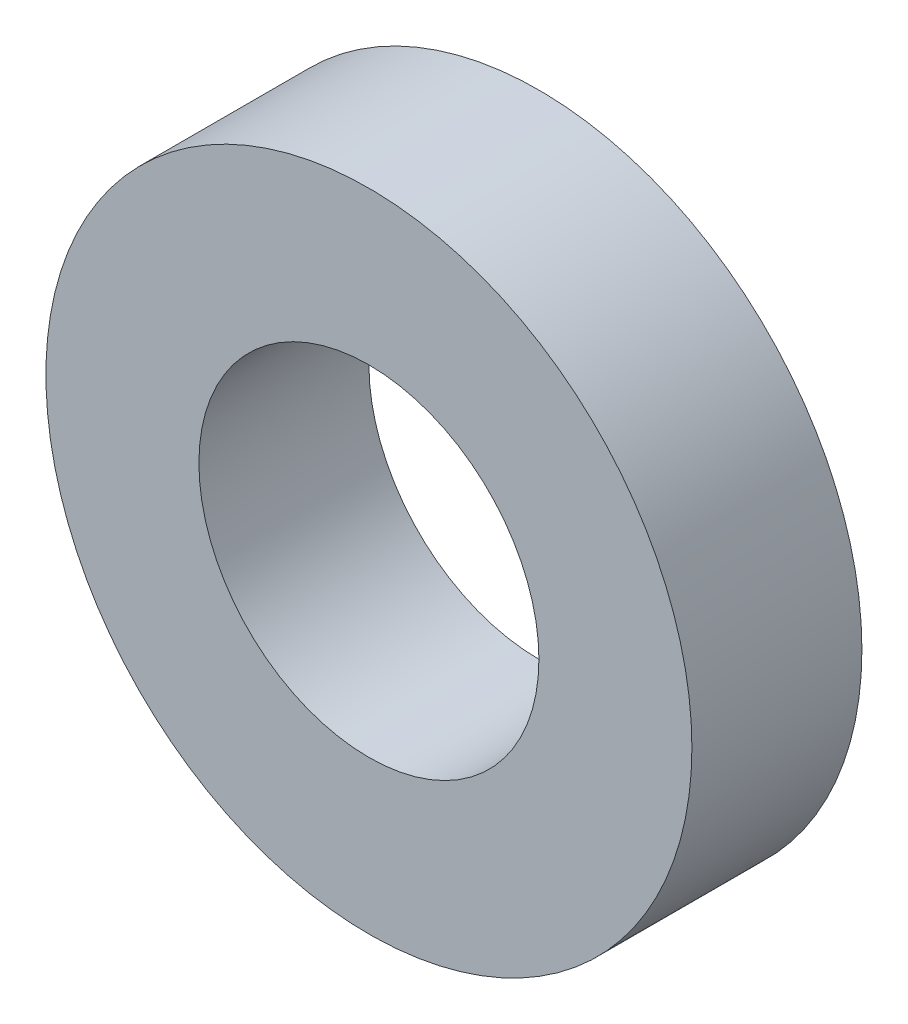
ISO-10303-21;
HEADER;
FILE_DESCRIPTION(('STEP AP214'),'2;1');
FILE_NAME('part.step','',(''),(''),'','','');
FILE_SCHEMA(('AUTOMOTIVE_DESIGN { 1 0 10303 214 1 1 1 1 }'));
ENDSEC;
DATA;
#1=APPLICATION_CONTEXT('core data for automotive mechanical design processes');
#2=APPLICATION_PROTOCOL_DEFINITION('international standard','automotive_design',2000,#1);
#3=PRODUCT_CONTEXT('',#1,'mechanical');
#4=PRODUCT('Part','Part','',(#3));
#5=PRODUCT_RELATED_PRODUCT_CATEGORY('part','',(#4));
#6=PRODUCT_DEFINITION_FORMATION('','',#4);
#7=PRODUCT_DEFINITION_CONTEXT('part definition',#1,'design');
#8=PRODUCT_DEFINITION('design','',#6,#7);
#9=PRODUCT_DEFINITION_SHAPE('','',#8);
#10=(LENGTH_UNIT() NAMED_UNIT(*) SI_UNIT(.MILLI.,.METRE.));
#11=(NAMED_UNIT(*) PLANE_ANGLE_UNIT() SI_UNIT($,.RADIAN.));
#12=(NAMED_UNIT(*) SI_UNIT($,.STERADIAN.) SOLID_ANGLE_UNIT());
#13=UNCERTAINTY_MEASURE_WITH_UNIT(LENGTH_MEASURE(1.E-05),#10,'distance_accuracy_value','');
#14=(GEOMETRIC_REPRESENTATION_CONTEXT(3) GLOBAL_UNCERTAINTY_ASSIGNED_CONTEXT((#13)) GLOBAL_UNIT_ASSIGNED_CONTEXT((#10,
#11,#12)) REPRESENTATION_CONTEXT('',''));
#15=CARTESIAN_POINT('',(0.,0.,0.));
#16=DIRECTION('',(0.,0.,1.));
#17=DIRECTION('',(1.,0.,0.));
#18=AXIS2_PLACEMENT_3D('',#15,#16,#17);
#19=CARTESIAN_POINT('',(0.,0.,5.));
#20=DIRECTION('',(0.,0.,-1.));
#21=DIRECTION('',(-1.,0.,0.));
#22=AXIS2_PLACEMENT_3D('',#19,#20,#21);
#23=CYLINDRICAL_SURFACE('',#22,9.5);
#24=CARTESIAN_POINT('',(0.,0.,5.));
#25=DIRECTION('',(0.,0.,1.));
#26=DIRECTION('',(1.,0.,0.));
#27=AXIS2_PLACEMENT_3D('',#24,#25,#26);
#28=CIRCLE('',#27,9.5);
#29=CARTESIAN_POINT('',(9.5,0.,5.));
#30=VERTEX_POINT('',#29);
#31=EDGE_CURVE('E10',#30,#30,#28,.T.);
#32=ORIENTED_EDGE('',*,*,#31,.F.);
#33=EDGE_LOOP('',(#32));
#34=FACE_BOUND('',#33,.T.);
#35=CARTESIAN_POINT('',(0.,0.,0.));
#36=DIRECTION('',(0.,0.,1.));
#37=DIRECTION('',(1.,0.,0.));
#38=AXIS2_PLACEMENT_3D('',#35,#36,#37);
#39=CIRCLE('',#38,9.5);
#40=CARTESIAN_POINT('',(9.5,0.,0.));
#41=VERTEX_POINT('',#40);
#42=EDGE_CURVE('E39',#41,#41,#39,.T.);
#43=ORIENTED_EDGE('',*,*,#42,.T.);
#44=EDGE_LOOP('',(#43));
#45=FACE_BOUND('',#44,.T.);
#46=ADVANCED_FACE('F36',(#34,#45),#23,.T.);
#47=CARTESIAN_POINT('',(0.,0.,5.));
#48=DIRECTION('',(0.,0.,1.));
#49=DIRECTION('',(1.,0.,0.));
#50=AXIS2_PLACEMENT_3D('',#47,#48,#49);
#51=PLANE('',#50);
#52=CARTESIAN_POINT('',(0.,0.,5.));
#53=DIRECTION('',(0.,0.,1.));
#54=DIRECTION('',(1.,0.,0.));
#55=AXIS2_PLACEMENT_3D('',#52,#53,#54);
#56=CIRCLE('',#55,5.);
#57=CARTESIAN_POINT('',(5.,0.,5.));
#58=VERTEX_POINT('',#57);
#59=EDGE_CURVE('E48',#58,#58,#56,.T.);
#60=ORIENTED_EDGE('',*,*,#59,.F.);
#61=EDGE_LOOP('',(#60));
#62=FACE_BOUND('',#61,.T.);
#63=ORIENTED_EDGE('',*,*,#31,.T.);
#64=EDGE_LOOP('',(#63));
#65=FACE_BOUND('',#64,.T.);
#66=ADVANCED_FACE('F63',(#62,#65),#51,.T.);
#67=CARTESIAN_POINT('',(0.,0.,0.));
#68=DIRECTION('',(0.,0.,1.));
#69=DIRECTION('',(1.,0.,0.));
#70=AXIS2_PLACEMENT_3D('',#67,#68,#69);
#71=PLANE('',#70);
#72=CARTESIAN_POINT('',(0.,0.,0.));
#73=DIRECTION('',(0.,0.,1.));
#74=DIRECTION('',(1.,0.,0.));
#75=AXIS2_PLACEMENT_3D('',#72,#73,#74);
#76=CIRCLE('',#75,5.);
#77=CARTESIAN_POINT('',(5.,0.,0.));
#78=VERTEX_POINT('',#77);
#79=EDGE_CURVE('E46',#78,#78,#76,.T.);
#80=ORIENTED_EDGE('',*,*,#79,.T.);
#81=EDGE_LOOP('',(#80));
#82=FACE_BOUND('',#81,.T.);
#83=ORIENTED_EDGE('',*,*,#42,.F.);
#84=EDGE_LOOP('',(#83));
#85=FACE_BOUND('',#84,.T.);
#86=ADVANCED_FACE('F54',(#82,#85),#71,.F.);
#87=CARTESIAN_POINT('',(0.,0.,0.));
#88=DIRECTION('',(0.,0.,1.));
#89=DIRECTION('',(1.,0.,0.));
#90=AXIS2_PLACEMENT_3D('',#87,#88,#89);
#91=CYLINDRICAL_SURFACE('',#90,5.);
#92=ORIENTED_EDGE('',*,*,#79,.F.);
#93=EDGE_LOOP('',(#92));
#94=FACE_BOUND('',#93,.T.);
#95=ORIENTED_EDGE('',*,*,#59,.T.);
#96=EDGE_LOOP('',(#95));
#97=FACE_BOUND('',#96,.T.);
#98=ADVANCED_FACE('F57',(#94,#97),#91,.F.);
#99=CLOSED_SHELL('',(#46,#66,#86,#98));
#100=MANIFOLD_SOLID_BREP('B2',#99);
#101=ADVANCED_BREP_SHAPE_REPRESENTATION('',(#18,#100),#14);
#102=SHAPE_DEFINITION_REPRESENTATION(#9,#101);
ENDSEC;
END-ISO-10303-21;
